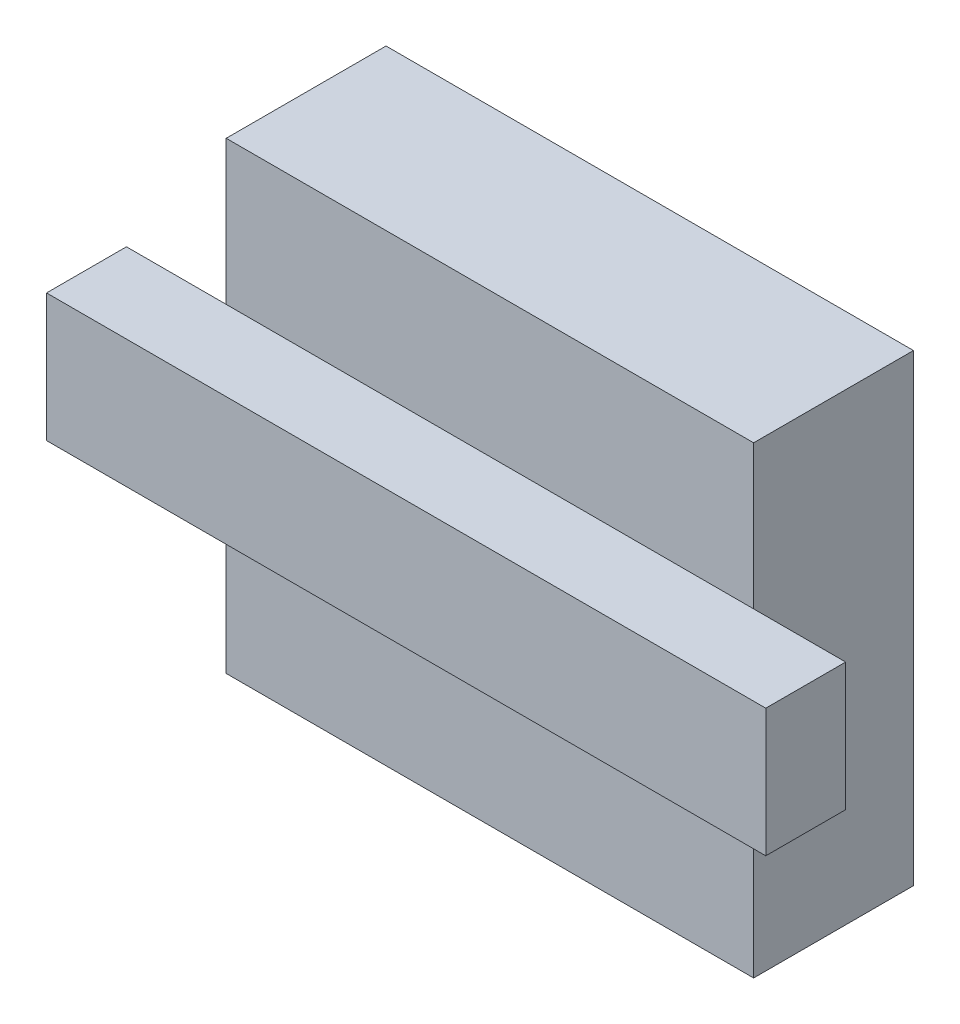
ISO-10303-21;
HEADER;
FILE_DESCRIPTION(('STEP AP214'),'2;1');
FILE_NAME('part.step','',(''),(''),'','','');
FILE_SCHEMA(('AUTOMOTIVE_DESIGN { 1 0 10303 214 1 1 1 1 }'));
ENDSEC;
DATA;
#1=APPLICATION_CONTEXT('core data for automotive mechanical design processes');
#2=APPLICATION_PROTOCOL_DEFINITION('international standard','automotive_design',2000,#1);
#3=PRODUCT_CONTEXT('',#1,'mechanical');
#4=PRODUCT('Part','Part','',(#3));
#5=PRODUCT_RELATED_PRODUCT_CATEGORY('part','',(#4));
#6=PRODUCT_DEFINITION_FORMATION('','',#4);
#7=PRODUCT_DEFINITION_CONTEXT('part definition',#1,'design');
#8=PRODUCT_DEFINITION('design','',#6,#7);
#9=PRODUCT_DEFINITION_SHAPE('','',#8);
#10=(LENGTH_UNIT() NAMED_UNIT(*) SI_UNIT(.MILLI.,.METRE.));
#11=(NAMED_UNIT(*) PLANE_ANGLE_UNIT() SI_UNIT($,.RADIAN.));
#12=(NAMED_UNIT(*) SI_UNIT($,.STERADIAN.) SOLID_ANGLE_UNIT());
#13=UNCERTAINTY_MEASURE_WITH_UNIT(LENGTH_MEASURE(1.E-05),#10,'distance_accuracy_value','');
#14=(GEOMETRIC_REPRESENTATION_CONTEXT(3) GLOBAL_UNCERTAINTY_ASSIGNED_CONTEXT((#13)) GLOBAL_UNIT_ASSIGNED_CONTEXT((#10,
#11,#12)) REPRESENTATION_CONTEXT('',''));
#15=CARTESIAN_POINT('',(0.,0.,0.));
#16=DIRECTION('',(0.,0.,1.));
#17=DIRECTION('',(1.,0.,0.));
#18=AXIS2_PLACEMENT_3D('',#15,#16,#17);
#19=CARTESIAN_POINT('',(0.,0.,10.));
#20=DIRECTION('',(0.,0.,-1.));
#21=DIRECTION('',(-1.,0.,0.));
#22=AXIS2_PLACEMENT_3D('',#19,#20,#21);
#23=PLANE('',#22);
#24=DIRECTION('',(1.,0.,0.));
#25=VECTOR('',#24,1.);
#26=CARTESIAN_POINT('',(0.,12.,10.));
#27=LINE('',#26,#25);
#28=CARTESIAN_POINT('',(0.,12.,10.));
#29=VERTEX_POINT('',#28);
#30=CARTESIAN_POINT('',(33.,12.,10.));
#31=VERTEX_POINT('',#30);
#32=EDGE_CURVE('E52',#29,#31,#27,.T.);
#33=ORIENTED_EDGE('',*,*,#32,.F.);
#34=DIRECTION('',(0.,-1.,0.));
#35=VECTOR('',#34,1.);
#36=CARTESIAN_POINT('',(0.,0.,10.));
#37=LINE('',#36,#35);
#38=CARTESIAN_POINT('',(0.,0.,10.));
#39=VERTEX_POINT('',#38);
#40=EDGE_CURVE('E160',#29,#39,#37,.T.);
#41=ORIENTED_EDGE('',*,*,#40,.T.);
#42=DIRECTION('',(1.,0.,0.));
#43=VECTOR('',#42,1.);
#44=CARTESIAN_POINT('',(0.,0.,10.));
#45=LINE('',#44,#43);
#46=CARTESIAN_POINT('',(33.,0.,10.));
#47=VERTEX_POINT('',#46);
#48=EDGE_CURVE('E158',#39,#47,#45,.T.);
#49=ORIENTED_EDGE('',*,*,#48,.T.);
#50=DIRECTION('',(0.,1.,0.));
#51=VECTOR('',#50,1.);
#52=CARTESIAN_POINT('',(33.,0.,10.));
#53=LINE('',#52,#51);
#54=EDGE_CURVE('E163',#47,#31,#53,.T.);
#55=ORIENTED_EDGE('',*,*,#54,.T.);
#56=EDGE_LOOP('',(#33,#41,#49,#55));
#57=FACE_BOUND('',#56,.T.);
#58=ADVANCED_FACE('F43',(#57),#23,.F.);
#59=CARTESIAN_POINT('',(0.,0.,10.));
#60=DIRECTION('',(1.,0.,0.));
#61=DIRECTION('',(0.,0.,-1.));
#62=AXIS2_PLACEMENT_3D('',#59,#60,#61);
#63=PLANE('',#62);
#64=DIRECTION('',(0.,-1.,0.));
#65=VECTOR('',#64,1.);
#66=CARTESIAN_POINT('',(0.,0.,0.));
#67=LINE('',#66,#65);
#68=CARTESIAN_POINT('',(0.,29.,0.));
#69=VERTEX_POINT('',#68);
#70=CARTESIAN_POINT('',(0.,0.,0.));
#71=VERTEX_POINT('',#70);
#72=EDGE_CURVE('E147',#69,#71,#67,.T.);
#73=ORIENTED_EDGE('',*,*,#72,.T.);
#74=DIRECTION('',(0.,0.,-1.));
#75=VECTOR('',#74,1.);
#76=CARTESIAN_POINT('',(0.,0.,10.));
#77=LINE('',#76,#75);
#78=EDGE_CURVE('E47',#39,#71,#77,.T.);
#79=ORIENTED_EDGE('',*,*,#78,.F.);
#80=ORIENTED_EDGE('',*,*,#40,.F.);
#81=CARTESIAN_POINT('',(0.,20.,10.));
#82=VERTEX_POINT('',#81);
#83=EDGE_CURVE('E159',#82,#29,#37,.T.);
#84=ORIENTED_EDGE('',*,*,#83,.F.);
#85=CARTESIAN_POINT('',(0.,29.,10.));
#86=VERTEX_POINT('',#85);
#87=EDGE_CURVE('E156',#86,#82,#37,.T.);
#88=ORIENTED_EDGE('',*,*,#87,.F.);
#89=DIRECTION('',(0.,0.,-1.));
#90=VECTOR('',#89,1.);
#91=CARTESIAN_POINT('',(0.,29.,10.));
#92=LINE('',#91,#90);
#93=EDGE_CURVE('E167',#86,#69,#92,.T.);
#94=ORIENTED_EDGE('',*,*,#93,.T.);
#95=EDGE_LOOP('',(#73,#79,#80,#84,#88,#94));
#96=FACE_BOUND('',#95,.T.);
#97=ADVANCED_FACE('F45',(#96),#63,.F.);
#98=CARTESIAN_POINT('',(0.,0.,10.));
#99=DIRECTION('',(0.,1.,0.));
#100=DIRECTION('',(0.,0.,1.));
#101=AXIS2_PLACEMENT_3D('',#98,#99,#100);
#102=PLANE('',#101);
#103=DIRECTION('',(1.,0.,0.));
#104=VECTOR('',#103,1.);
#105=CARTESIAN_POINT('',(0.,0.,0.));
#106=LINE('',#105,#104);
#107=CARTESIAN_POINT('',(33.,0.,0.));
#108=VERTEX_POINT('',#107);
#109=EDGE_CURVE('E150',#71,#108,#106,.T.);
#110=ORIENTED_EDGE('',*,*,#109,.T.);
#111=DIRECTION('',(0.,0.,-1.));
#112=VECTOR('',#111,1.);
#113=CARTESIAN_POINT('',(33.,0.,10.));
#114=LINE('',#113,#112);
#115=EDGE_CURVE('E178',#47,#108,#114,.T.);
#116=ORIENTED_EDGE('',*,*,#115,.F.);
#117=ORIENTED_EDGE('',*,*,#48,.F.);
#118=ORIENTED_EDGE('',*,*,#78,.T.);
#119=EDGE_LOOP('',(#110,#116,#117,#118));
#120=FACE_BOUND('',#119,.T.);
#121=ADVANCED_FACE('F218',(#120),#102,.F.);
#122=CARTESIAN_POINT('',(33.,0.,10.));
#123=DIRECTION('',(-1.,0.,0.));
#124=DIRECTION('',(0.,0.,1.));
#125=AXIS2_PLACEMENT_3D('',#122,#123,#124);
#126=PLANE('',#125);
#127=DIRECTION('',(0.,1.,0.));
#128=VECTOR('',#127,1.);
#129=CARTESIAN_POINT('',(33.,0.,0.));
#130=LINE('',#129,#128);
#131=CARTESIAN_POINT('',(33.,29.,0.));
#132=VERTEX_POINT('',#131);
#133=EDGE_CURVE('E170',#108,#132,#130,.T.);
#134=ORIENTED_EDGE('',*,*,#133,.T.);
#135=DIRECTION('',(0.,0.,-1.));
#136=VECTOR('',#135,1.);
#137=CARTESIAN_POINT('',(33.,29.,10.));
#138=LINE('',#137,#136);
#139=CARTESIAN_POINT('',(33.,29.,10.));
#140=VERTEX_POINT('',#139);
#141=EDGE_CURVE('E176',#140,#132,#138,.T.);
#142=ORIENTED_EDGE('',*,*,#141,.F.);
#143=CARTESIAN_POINT('',(33.,20.,10.));
#144=VERTEX_POINT('',#143);
#145=EDGE_CURVE('E162',#144,#140,#53,.T.);
#146=ORIENTED_EDGE('',*,*,#145,.F.);
#147=EDGE_CURVE('E166',#31,#144,#53,.T.);
#148=ORIENTED_EDGE('',*,*,#147,.F.);
#149=ORIENTED_EDGE('',*,*,#54,.F.);
#150=ORIENTED_EDGE('',*,*,#115,.T.);
#151=EDGE_LOOP('',(#134,#142,#146,#148,#149,#150));
#152=FACE_BOUND('',#151,.T.);
#153=ADVANCED_FACE('F225',(#152),#126,.F.);
#154=CARTESIAN_POINT('',(0.,29.,10.));
#155=DIRECTION('',(0.,-1.,0.));
#156=DIRECTION('',(0.,0.,-1.));
#157=AXIS2_PLACEMENT_3D('',#154,#155,#156);
#158=PLANE('',#157);
#159=DIRECTION('',(-1.,0.,0.));
#160=VECTOR('',#159,1.);
#161=CARTESIAN_POINT('',(0.,29.,0.));
#162=LINE('',#161,#160);
#163=EDGE_CURVE('E172',#132,#69,#162,.T.);
#164=ORIENTED_EDGE('',*,*,#163,.T.);
#165=ORIENTED_EDGE('',*,*,#93,.F.);
#166=DIRECTION('',(-1.,0.,0.));
#167=VECTOR('',#166,1.);
#168=CARTESIAN_POINT('',(0.,29.,10.));
#169=LINE('',#168,#167);
#170=EDGE_CURVE('E165',#140,#86,#169,.T.);
#171=ORIENTED_EDGE('',*,*,#170,.F.);
#172=ORIENTED_EDGE('',*,*,#141,.T.);
#173=EDGE_LOOP('',(#164,#165,#171,#172));
#174=FACE_BOUND('',#173,.T.);
#175=ADVANCED_FACE('F228',(#174),#158,.F.);
#176=ORIENTED_EDGE('',*,*,#87,.T.);
#177=DIRECTION('',(1.,0.,0.));
#178=VECTOR('',#177,1.);
#179=CARTESIAN_POINT('',(0.,20.,10.));
#180=LINE('',#179,#178);
#181=EDGE_CURVE('E11',#82,#144,#180,.T.);
#182=ORIENTED_EDGE('',*,*,#181,.T.);
#183=ORIENTED_EDGE('',*,*,#145,.T.);
#184=ORIENTED_EDGE('',*,*,#170,.T.);
#185=EDGE_LOOP('',(#176,#182,#183,#184));
#186=FACE_BOUND('',#185,.T.);
#187=ADVANCED_FACE('F229',(#186),#23,.F.);
#188=CARTESIAN_POINT('',(0.,0.,0.));
#189=DIRECTION('',(0.,0.,-1.));
#190=DIRECTION('',(-1.,0.,0.));
#191=AXIS2_PLACEMENT_3D('',#188,#189,#190);
#192=PLANE('',#191);
#193=ORIENTED_EDGE('',*,*,#72,.F.);
#194=ORIENTED_EDGE('',*,*,#163,.F.);
#195=ORIENTED_EDGE('',*,*,#133,.F.);
#196=ORIENTED_EDGE('',*,*,#109,.F.);
#197=EDGE_LOOP('',(#193,#194,#195,#196));
#198=FACE_BOUND('',#197,.T.);
#199=ADVANCED_FACE('F223',(#198),#192,.T.);
#200=CARTESIAN_POINT('',(0.,0.,10.));
#201=DIRECTION('',(0.,0.,1.));
#202=DIRECTION('',(1.,0.,0.));
#203=AXIS2_PLACEMENT_3D('',#200,#201,#202);
#204=PLANE('',#203);
#205=CARTESIAN_POINT('',(-6.24137587238285,20.,10.));
#206=VERTEX_POINT('',#205);
#207=EDGE_CURVE('E54',#206,#82,#180,.T.);
#208=ORIENTED_EDGE('',*,*,#207,.T.);
#209=ORIENTED_EDGE('',*,*,#83,.T.);
#210=CARTESIAN_POINT('',(-6.24137587238284,12.,10.));
#211=VERTEX_POINT('',#210);
#212=EDGE_CURVE('E189',#211,#29,#27,.T.);
#213=ORIENTED_EDGE('',*,*,#212,.F.);
#214=DIRECTION('',(0.,-1.,0.));
#215=VECTOR('',#214,1.);
#216=CARTESIAN_POINT('',(-6.24137587238284,0.,10.));
#217=LINE('',#216,#215);
#218=EDGE_CURVE('E146',#206,#211,#217,.T.);
#219=ORIENTED_EDGE('',*,*,#218,.F.);
#220=EDGE_LOOP('',(#208,#209,#213,#219));
#221=FACE_BOUND('',#220,.T.);
#222=ADVANCED_FACE('F215',(#221),#204,.F.);
#223=CARTESIAN_POINT('',(38.7586241276172,12.,10.));
#224=VERTEX_POINT('',#223);
#225=EDGE_CURVE('E190',#31,#224,#27,.T.);
#226=ORIENTED_EDGE('',*,*,#225,.F.);
#227=ORIENTED_EDGE('',*,*,#147,.T.);
#228=CARTESIAN_POINT('',(38.7586241276172,20.,10.));
#229=VERTEX_POINT('',#228);
#230=EDGE_CURVE('E55',#144,#229,#180,.T.);
#231=ORIENTED_EDGE('',*,*,#230,.T.);
#232=DIRECTION('',(0.,-1.,0.));
#233=VECTOR('',#232,1.);
#234=CARTESIAN_POINT('',(38.7586241276172,0.,10.));
#235=LINE('',#234,#233);
#236=EDGE_CURVE('E193',#229,#224,#235,.T.);
#237=ORIENTED_EDGE('',*,*,#236,.T.);
#238=EDGE_LOOP('',(#226,#227,#231,#237));
#239=FACE_BOUND('',#238,.T.);
#240=ADVANCED_FACE('F211',(#239),#204,.F.);
#241=CARTESIAN_POINT('',(-6.24137587238284,0.,15.));
#242=DIRECTION('',(1.,0.,0.));
#243=DIRECTION('',(0.,1.,0.));
#244=AXIS2_PLACEMENT_3D('',#241,#242,#243);
#245=PLANE('',#244);
#246=ORIENTED_EDGE('',*,*,#218,.T.);
#247=DIRECTION('',(0.,0.,-1.));
#248=VECTOR('',#247,1.);
#249=CARTESIAN_POINT('',(-6.24137587238284,12.,15.));
#250=LINE('',#249,#248);
#251=CARTESIAN_POINT('',(-6.24137587238284,12.,15.));
#252=VERTEX_POINT('',#251);
#253=EDGE_CURVE('E127',#252,#211,#250,.T.);
#254=ORIENTED_EDGE('',*,*,#253,.F.);
#255=DIRECTION('',(0.,-1.,0.));
#256=VECTOR('',#255,1.);
#257=CARTESIAN_POINT('',(-6.24137587238284,0.,15.));
#258=LINE('',#257,#256);
#259=CARTESIAN_POINT('',(-6.24137587238285,20.,15.));
#260=VERTEX_POINT('',#259);
#261=EDGE_CURVE('E135',#260,#252,#258,.T.);
#262=ORIENTED_EDGE('',*,*,#261,.F.);
#263=DIRECTION('',(0.,0.,-1.));
#264=VECTOR('',#263,1.);
#265=CARTESIAN_POINT('',(-6.24137587238285,20.,15.));
#266=LINE('',#265,#264);
#267=EDGE_CURVE('E197',#260,#206,#266,.T.);
#268=ORIENTED_EDGE('',*,*,#267,.T.);
#269=EDGE_LOOP('',(#246,#254,#262,#268));
#270=FACE_BOUND('',#269,.T.);
#271=ADVANCED_FACE('F144',(#270),#245,.F.);
#272=CARTESIAN_POINT('',(0.,12.,15.));
#273=DIRECTION('',(0.,1.,0.));
#274=DIRECTION('',(-1.,0.,0.));
#275=AXIS2_PLACEMENT_3D('',#272,#273,#274);
#276=PLANE('',#275);
#277=ORIENTED_EDGE('',*,*,#212,.T.);
#278=ORIENTED_EDGE('',*,*,#32,.T.);
#279=ORIENTED_EDGE('',*,*,#225,.T.);
#280=DIRECTION('',(0.,0.,-1.));
#281=VECTOR('',#280,1.);
#282=CARTESIAN_POINT('',(38.7586241276172,12.,15.));
#283=LINE('',#282,#281);
#284=CARTESIAN_POINT('',(38.7586241276172,12.,15.));
#285=VERTEX_POINT('',#284);
#286=EDGE_CURVE('E130',#285,#224,#283,.T.);
#287=ORIENTED_EDGE('',*,*,#286,.F.);
#288=DIRECTION('',(1.,0.,0.));
#289=VECTOR('',#288,1.);
#290=CARTESIAN_POINT('',(0.,12.,15.));
#291=LINE('',#290,#289);
#292=EDGE_CURVE('E122',#252,#285,#291,.T.);
#293=ORIENTED_EDGE('',*,*,#292,.F.);
#294=ORIENTED_EDGE('',*,*,#253,.T.);
#295=EDGE_LOOP('',(#277,#278,#279,#287,#293,#294));
#296=FACE_BOUND('',#295,.T.);
#297=ADVANCED_FACE('F125',(#296),#276,.F.);
#298=CARTESIAN_POINT('',(38.7586241276172,0.,15.));
#299=DIRECTION('',(1.,0.,0.));
#300=DIRECTION('',(0.,0.,-1.));
#301=AXIS2_PLACEMENT_3D('',#298,#299,#300);
#302=PLANE('',#301);
#303=ORIENTED_EDGE('',*,*,#236,.F.);
#304=DIRECTION('',(0.,0.,-1.));
#305=VECTOR('',#304,1.);
#306=CARTESIAN_POINT('',(38.7586241276172,20.,15.));
#307=LINE('',#306,#305);
#308=CARTESIAN_POINT('',(38.7586241276172,20.,15.));
#309=VERTEX_POINT('',#308);
#310=EDGE_CURVE('E152',#309,#229,#307,.T.);
#311=ORIENTED_EDGE('',*,*,#310,.F.);
#312=DIRECTION('',(0.,-1.,0.));
#313=VECTOR('',#312,1.);
#314=CARTESIAN_POINT('',(38.7586241276172,0.,15.));
#315=LINE('',#314,#313);
#316=EDGE_CURVE('E134',#309,#285,#315,.T.);
#317=ORIENTED_EDGE('',*,*,#316,.T.);
#318=ORIENTED_EDGE('',*,*,#286,.T.);
#319=EDGE_LOOP('',(#303,#311,#317,#318));
#320=FACE_BOUND('',#319,.T.);
#321=ADVANCED_FACE('F200',(#320),#302,.T.);
#322=CARTESIAN_POINT('',(0.,20.,15.));
#323=DIRECTION('',(0.,1.,0.));
#324=DIRECTION('',(-1.,0.,0.));
#325=AXIS2_PLACEMENT_3D('',#322,#323,#324);
#326=PLANE('',#325);
#327=ORIENTED_EDGE('',*,*,#207,.F.);
#328=ORIENTED_EDGE('',*,*,#267,.F.);
#329=DIRECTION('',(1.,0.,0.));
#330=VECTOR('',#329,1.);
#331=CARTESIAN_POINT('',(0.,20.,15.));
#332=LINE('',#331,#330);
#333=EDGE_CURVE('E141',#260,#309,#332,.T.);
#334=ORIENTED_EDGE('',*,*,#333,.T.);
#335=ORIENTED_EDGE('',*,*,#310,.T.);
#336=ORIENTED_EDGE('',*,*,#230,.F.);
#337=ORIENTED_EDGE('',*,*,#181,.F.);
#338=EDGE_LOOP('',(#327,#328,#334,#335,#336,#337));
#339=FACE_BOUND('',#338,.T.);
#340=ADVANCED_FACE('F205',(#339),#326,.T.);
#341=CARTESIAN_POINT('',(0.,0.,15.));
#342=DIRECTION('',(0.,0.,1.));
#343=DIRECTION('',(1.,0.,0.));
#344=AXIS2_PLACEMENT_3D('',#341,#342,#343);
#345=PLANE('',#344);
#346=ORIENTED_EDGE('',*,*,#261,.T.);
#347=ORIENTED_EDGE('',*,*,#292,.T.);
#348=ORIENTED_EDGE('',*,*,#316,.F.);
#349=ORIENTED_EDGE('',*,*,#333,.F.);
#350=EDGE_LOOP('',(#346,#347,#348,#349));
#351=FACE_BOUND('',#350,.T.);
#352=ADVANCED_FACE('F139',(#351),#345,.T.);
#353=CLOSED_SHELL('',(#58,#97,#121,#153,#175,#187,#199,#222,#240,#271,#297,#321,#340,#352));
#354=MANIFOLD_SOLID_BREP('B2',#353);
#355=ADVANCED_BREP_SHAPE_REPRESENTATION('',(#18,#354),#14);
#356=SHAPE_DEFINITION_REPRESENTATION(#9,#355);
ENDSEC;
END-ISO-10303-21;
